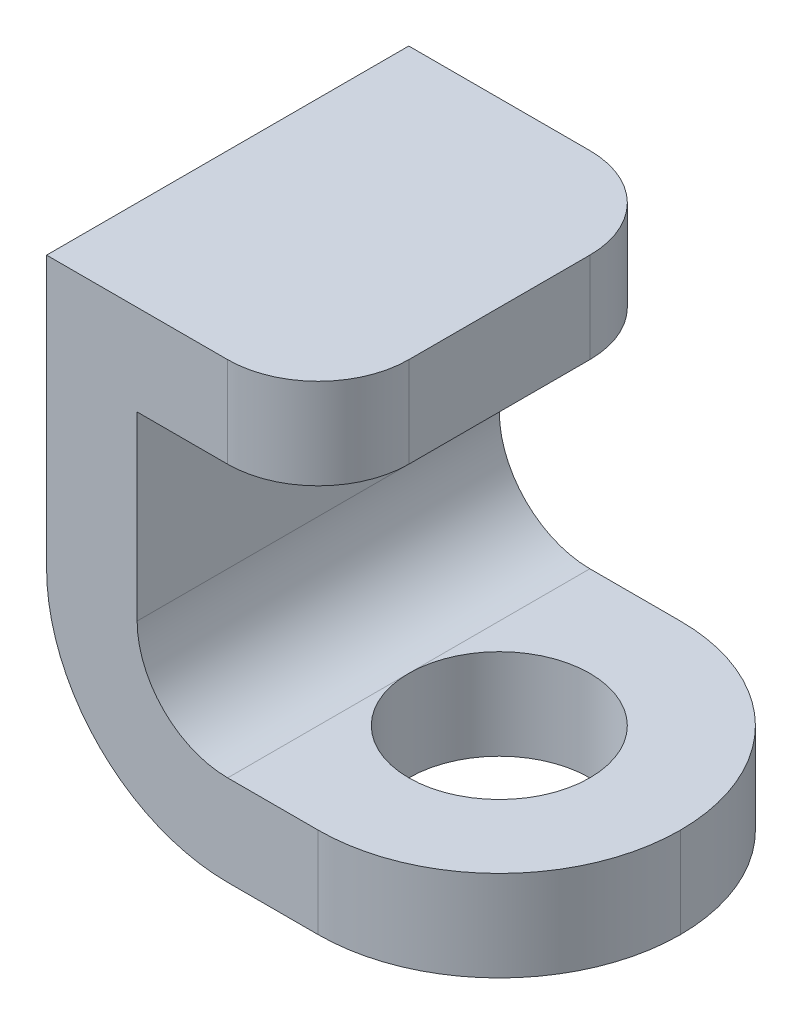
ISO-10303-21;
HEADER;
FILE_DESCRIPTION(('STEP AP214'),'2;1');
FILE_NAME('part.step','',(''),(''),'','','');
FILE_SCHEMA(('AUTOMOTIVE_DESIGN { 1 0 10303 214 1 1 1 1 }'));
ENDSEC;
DATA;
#1=APPLICATION_CONTEXT('core data for automotive mechanical design processes');
#2=APPLICATION_PROTOCOL_DEFINITION('international standard','automotive_design',2000,#1);
#3=PRODUCT_CONTEXT('',#1,'mechanical');
#4=PRODUCT('Part','Part','',(#3));
#5=PRODUCT_RELATED_PRODUCT_CATEGORY('part','',(#4));
#6=PRODUCT_DEFINITION_FORMATION('','',#4);
#7=PRODUCT_DEFINITION_CONTEXT('part definition',#1,'design');
#8=PRODUCT_DEFINITION('design','',#6,#7);
#9=PRODUCT_DEFINITION_SHAPE('','',#8);
#10=(LENGTH_UNIT() NAMED_UNIT(*) SI_UNIT(.MILLI.,.METRE.));
#11=(NAMED_UNIT(*) PLANE_ANGLE_UNIT() SI_UNIT($,.RADIAN.));
#12=(NAMED_UNIT(*) SI_UNIT($,.STERADIAN.) SOLID_ANGLE_UNIT());
#13=UNCERTAINTY_MEASURE_WITH_UNIT(LENGTH_MEASURE(1.E-05),#10,'distance_accuracy_value','');
#14=(GEOMETRIC_REPRESENTATION_CONTEXT(3) GLOBAL_UNCERTAINTY_ASSIGNED_CONTEXT((#13)) GLOBAL_UNIT_ASSIGNED_CONTEXT((#10,
#11,#12)) REPRESENTATION_CONTEXT('',''));
#15=CARTESIAN_POINT('',(0.,0.,0.));
#16=DIRECTION('',(0.,0.,1.));
#17=DIRECTION('',(1.,0.,0.));
#18=AXIS2_PLACEMENT_3D('',#15,#16,#17);
#19=CARTESIAN_POINT('',(5.,0.,-20.));
#20=DIRECTION('',(-1.,0.,0.));
#21=DIRECTION('',(0.,0.,1.));
#22=AXIS2_PLACEMENT_3D('',#19,#20,#21);
#23=PLANE('',#22);
#24=DIRECTION('',(0.,-1.,0.));
#25=VECTOR('',#24,1.);
#26=CARTESIAN_POINT('',(5.,0.,0.));
#27=LINE('',#26,#25);
#28=CARTESIAN_POINT('',(5.,-5.,0.));
#29=VERTEX_POINT('',#28);
#30=CARTESIAN_POINT('',(5.,-15.,0.));
#31=VERTEX_POINT('',#30);
#32=EDGE_CURVE('E171',#29,#31,#27,.T.);
#33=ORIENTED_EDGE('',*,*,#32,.T.);
#34=DIRECTION('',(0.,0.,1.));
#35=VECTOR('',#34,1.);
#36=CARTESIAN_POINT('',(5.,-15.,-20.));
#37=LINE('',#36,#35);
#38=CARTESIAN_POINT('',(5.,-15.,-20.));
#39=VERTEX_POINT('',#38);
#40=EDGE_CURVE('E149',#31,#39,#37,.F.);
#41=ORIENTED_EDGE('',*,*,#40,.T.);
#42=DIRECTION('',(0.,-1.,0.));
#43=VECTOR('',#42,1.);
#44=CARTESIAN_POINT('',(5.,0.,-20.));
#45=LINE('',#44,#43);
#46=CARTESIAN_POINT('',(5.,-5.,-20.));
#47=VERTEX_POINT('',#46);
#48=EDGE_CURVE('E147',#47,#39,#45,.T.);
#49=ORIENTED_EDGE('',*,*,#48,.F.);
#50=DIRECTION('',(0.,0.,1.));
#51=VECTOR('',#50,1.);
#52=CARTESIAN_POINT('',(5.,-5.,-20.));
#53=LINE('',#52,#51);
#54=EDGE_CURVE('E133',#47,#29,#53,.T.);
#55=ORIENTED_EDGE('',*,*,#54,.T.);
#56=EDGE_LOOP('',(#33,#41,#49,#55));
#57=FACE_BOUND('',#56,.T.);
#58=ADVANCED_FACE('F35',(#57),#23,.F.);
#59=CARTESIAN_POINT('',(0.,-20.,-20.));
#60=DIRECTION('',(0.,-1.,0.));
#61=DIRECTION('',(1.,0.,0.));
#62=AXIS2_PLACEMENT_3D('',#59,#60,#61);
#63=PLANE('',#62);
#64=DIRECTION('',(0.,0.,1.));
#65=VECTOR('',#64,1.);
#66=CARTESIAN_POINT('',(10.,-20.,0.));
#67=LINE('',#66,#65);
#68=CARTESIAN_POINT('',(10.,-20.,-20.));
#69=VERTEX_POINT('',#68);
#70=CARTESIAN_POINT('',(10.,-20.,-10.));
#71=VERTEX_POINT('',#70);
#72=EDGE_CURVE('E221',#69,#71,#67,.T.);
#73=ORIENTED_EDGE('',*,*,#72,.T.);
#74=CARTESIAN_POINT('',(15.,-20.,-10.));
#75=DIRECTION('',(0.,1.,0.));
#76=DIRECTION('',(-1.,0.,0.));
#77=AXIS2_PLACEMENT_3D('',#74,#75,#76);
#78=CIRCLE('',#77,5.);
#79=EDGE_CURVE('E53',#71,#71,#78,.T.);
#80=ORIENTED_EDGE('',*,*,#79,.F.);
#81=CARTESIAN_POINT('',(10.,-20.,0.));
#82=VERTEX_POINT('',#81);
#83=EDGE_CURVE('E218',#71,#82,#67,.T.);
#84=ORIENTED_EDGE('',*,*,#83,.T.);
#85=DIRECTION('',(1.,0.,0.));
#86=VECTOR('',#85,1.);
#87=CARTESIAN_POINT('',(0.,-20.,0.));
#88=LINE('',#87,#86);
#89=CARTESIAN_POINT('',(15.,-20.,0.));
#90=VERTEX_POINT('',#89);
#91=EDGE_CURVE('E152',#82,#90,#88,.T.);
#92=ORIENTED_EDGE('',*,*,#91,.T.);
#93=CARTESIAN_POINT('',(15.,-20.,-10.));
#94=DIRECTION('',(0.,-1.,0.));
#95=DIRECTION('',(1.,0.,0.));
#96=AXIS2_PLACEMENT_3D('',#93,#94,#95);
#97=CIRCLE('',#96,10.);
#98=CARTESIAN_POINT('',(25.,-20.,-10.));
#99=VERTEX_POINT('',#98);
#100=EDGE_CURVE('E205',#90,#99,#97,.F.);
#101=ORIENTED_EDGE('',*,*,#100,.T.);
#102=CARTESIAN_POINT('',(15.,-20.,-10.));
#103=DIRECTION('',(0.,-1.,0.));
#104=DIRECTION('',(1.,0.,0.));
#105=AXIS2_PLACEMENT_3D('',#102,#103,#104);
#106=CIRCLE('',#105,10.);
#107=CARTESIAN_POINT('',(15.,-20.,-20.));
#108=VERTEX_POINT('',#107);
#109=EDGE_CURVE('E207',#99,#108,#106,.F.);
#110=ORIENTED_EDGE('',*,*,#109,.T.);
#111=DIRECTION('',(1.,0.,0.));
#112=VECTOR('',#111,1.);
#113=CARTESIAN_POINT('',(0.,-20.,-20.));
#114=LINE('',#113,#112);
#115=EDGE_CURVE('E144',#69,#108,#114,.T.);
#116=ORIENTED_EDGE('',*,*,#115,.F.);
#117=EDGE_LOOP('',(#73,#80,#84,#92,#101,#110,#116));
#118=FACE_BOUND('',#117,.T.);
#119=ADVANCED_FACE('F250',(#118),#63,.F.);
#120=CARTESIAN_POINT('',(0.,-25.,-20.));
#121=DIRECTION('',(0.,-1.,0.));
#122=DIRECTION('',(1.,0.,0.));
#123=AXIS2_PLACEMENT_3D('',#120,#121,#122);
#124=PLANE('',#123);
#125=DIRECTION('',(0.,0.,1.));
#126=VECTOR('',#125,1.);
#127=CARTESIAN_POINT('',(10.,-25.,-20.));
#128=LINE('',#127,#126);
#129=CARTESIAN_POINT('',(10.,-25.,0.));
#130=VERTEX_POINT('',#129);
#131=CARTESIAN_POINT('',(10.,-25.,-10.));
#132=VERTEX_POINT('',#131);
#133=EDGE_CURVE('E198',#130,#132,#128,.F.);
#134=ORIENTED_EDGE('',*,*,#133,.T.);
#135=CARTESIAN_POINT('',(15.,-25.,-10.));
#136=DIRECTION('',(0.,1.,0.));
#137=DIRECTION('',(-1.,0.,0.));
#138=AXIS2_PLACEMENT_3D('',#135,#136,#137);
#139=CIRCLE('',#138,5.);
#140=EDGE_CURVE('E48',#132,#132,#139,.T.);
#141=ORIENTED_EDGE('',*,*,#140,.T.);
#142=CARTESIAN_POINT('',(10.,-25.,-20.));
#143=VERTEX_POINT('',#142);
#144=EDGE_CURVE('E197',#132,#143,#128,.F.);
#145=ORIENTED_EDGE('',*,*,#144,.T.);
#146=DIRECTION('',(1.,0.,0.));
#147=VECTOR('',#146,1.);
#148=CARTESIAN_POINT('',(0.,-25.,-20.));
#149=LINE('',#148,#147);
#150=CARTESIAN_POINT('',(15.,-25.,-20.));
#151=VERTEX_POINT('',#150);
#152=EDGE_CURVE('E167',#143,#151,#149,.T.);
#153=ORIENTED_EDGE('',*,*,#152,.T.);
#154=CARTESIAN_POINT('',(15.,-25.,-10.));
#155=DIRECTION('',(0.,-1.,0.));
#156=DIRECTION('',(1.,0.,0.));
#157=AXIS2_PLACEMENT_3D('',#154,#155,#156);
#158=CIRCLE('',#157,10.);
#159=CARTESIAN_POINT('',(25.,-25.,-10.));
#160=VERTEX_POINT('',#159);
#161=EDGE_CURVE('E203',#151,#160,#158,.T.);
#162=ORIENTED_EDGE('',*,*,#161,.T.);
#163=CARTESIAN_POINT('',(15.,-25.,-10.));
#164=DIRECTION('',(0.,-1.,0.));
#165=DIRECTION('',(1.,0.,0.));
#166=AXIS2_PLACEMENT_3D('',#163,#164,#165);
#167=CIRCLE('',#166,10.);
#168=CARTESIAN_POINT('',(15.,-25.,0.));
#169=VERTEX_POINT('',#168);
#170=EDGE_CURVE('E201',#160,#169,#167,.T.);
#171=ORIENTED_EDGE('',*,*,#170,.T.);
#172=DIRECTION('',(1.,0.,0.));
#173=VECTOR('',#172,1.);
#174=CARTESIAN_POINT('',(0.,-25.,0.));
#175=LINE('',#174,#173);
#176=EDGE_CURVE('E181',#130,#169,#175,.T.);
#177=ORIENTED_EDGE('',*,*,#176,.F.);
#178=EDGE_LOOP('',(#134,#141,#145,#153,#162,#171,#177));
#179=FACE_BOUND('',#178,.T.);
#180=ADVANCED_FACE('F260',(#179),#124,.T.);
#181=CARTESIAN_POINT('',(0.,0.,-20.));
#182=DIRECTION('',(-1.,0.,0.));
#183=DIRECTION('',(0.,0.,1.));
#184=AXIS2_PLACEMENT_3D('',#181,#182,#183);
#185=PLANE('',#184);
#186=DIRECTION('',(0.,-1.,0.));
#187=VECTOR('',#186,1.);
#188=CARTESIAN_POINT('',(0.,0.,-20.));
#189=LINE('',#188,#187);
#190=CARTESIAN_POINT('',(0.,0.,-20.));
#191=VERTEX_POINT('',#190);
#192=CARTESIAN_POINT('',(0.,-15.,-20.));
#193=VERTEX_POINT('',#192);
#194=EDGE_CURVE('E161',#191,#193,#189,.T.);
#195=ORIENTED_EDGE('',*,*,#194,.T.);
#196=DIRECTION('',(0.,0.,1.));
#197=VECTOR('',#196,1.);
#198=CARTESIAN_POINT('',(0.,-15.,-20.));
#199=LINE('',#198,#197);
#200=CARTESIAN_POINT('',(0.,-15.,0.));
#201=VERTEX_POINT('',#200);
#202=EDGE_CURVE('E215',#193,#201,#199,.T.);
#203=ORIENTED_EDGE('',*,*,#202,.T.);
#204=DIRECTION('',(0.,-1.,0.));
#205=VECTOR('',#204,1.);
#206=CARTESIAN_POINT('',(0.,0.,0.));
#207=LINE('',#206,#205);
#208=CARTESIAN_POINT('',(0.,0.,0.));
#209=VERTEX_POINT('',#208);
#210=EDGE_CURVE('E178',#209,#201,#207,.T.);
#211=ORIENTED_EDGE('',*,*,#210,.F.);
#212=DIRECTION('',(0.,0.,1.));
#213=VECTOR('',#212,1.);
#214=CARTESIAN_POINT('',(0.,0.,-20.));
#215=LINE('',#214,#213);
#216=EDGE_CURVE('E185',#191,#209,#215,.T.);
#217=ORIENTED_EDGE('',*,*,#216,.F.);
#218=EDGE_LOOP('',(#195,#203,#211,#217));
#219=FACE_BOUND('',#218,.T.);
#220=ADVANCED_FACE('F296',(#219),#185,.T.);
#221=CARTESIAN_POINT('',(0.,0.,-20.));
#222=DIRECTION('',(0.,-1.,0.));
#223=DIRECTION('',(0.,0.,-1.));
#224=AXIS2_PLACEMENT_3D('',#221,#222,#223);
#225=PLANE('',#224);
#226=DIRECTION('',(0.,0.,1.));
#227=VECTOR('',#226,1.);
#228=CARTESIAN_POINT('',(15.,0.,-20.));
#229=LINE('',#228,#227);
#230=CARTESIAN_POINT('',(15.,0.,-15.));
#231=VERTEX_POINT('',#230);
#232=CARTESIAN_POINT('',(15.,0.,-5.));
#233=VERTEX_POINT('',#232);
#234=EDGE_CURVE('E188',#231,#233,#229,.T.);
#235=ORIENTED_EDGE('',*,*,#234,.F.);
#236=CARTESIAN_POINT('',(10.,0.,-15.));
#237=DIRECTION('',(0.,-1.,0.));
#238=DIRECTION('',(0.,0.,-1.));
#239=AXIS2_PLACEMENT_3D('',#236,#237,#238);
#240=CIRCLE('',#239,5.);
#241=CARTESIAN_POINT('',(10.,0.,-20.));
#242=VERTEX_POINT('',#241);
#243=EDGE_CURVE('E237',#231,#242,#240,.F.);
#244=ORIENTED_EDGE('',*,*,#243,.T.);
#245=DIRECTION('',(1.,0.,0.));
#246=VECTOR('',#245,1.);
#247=CARTESIAN_POINT('',(0.,0.,-20.));
#248=LINE('',#247,#246);
#249=EDGE_CURVE('E159',#191,#242,#248,.T.);
#250=ORIENTED_EDGE('',*,*,#249,.F.);
#251=ORIENTED_EDGE('',*,*,#216,.T.);
#252=DIRECTION('',(1.,0.,0.));
#253=VECTOR('',#252,1.);
#254=CARTESIAN_POINT('',(0.,0.,0.));
#255=LINE('',#254,#253);
#256=CARTESIAN_POINT('',(10.,0.,0.));
#257=VERTEX_POINT('',#256);
#258=EDGE_CURVE('E175',#209,#257,#255,.T.);
#259=ORIENTED_EDGE('',*,*,#258,.T.);
#260=CARTESIAN_POINT('',(10.,0.,-5.));
#261=DIRECTION('',(0.,-1.,0.));
#262=DIRECTION('',(0.,0.,-1.));
#263=AXIS2_PLACEMENT_3D('',#260,#261,#262);
#264=CIRCLE('',#263,5.);
#265=EDGE_CURVE('E235',#257,#233,#264,.F.);
#266=ORIENTED_EDGE('',*,*,#265,.T.);
#267=EDGE_LOOP('',(#235,#244,#250,#251,#259,#266));
#268=FACE_BOUND('',#267,.T.);
#269=ADVANCED_FACE('F292',(#268),#225,.F.);
#270=CARTESIAN_POINT('',(15.,0.,-20.));
#271=DIRECTION('',(-1.,0.,0.));
#272=DIRECTION('',(0.,0.,1.));
#273=AXIS2_PLACEMENT_3D('',#270,#271,#272);
#274=PLANE('',#273);
#275=DIRECTION('',(0.,0.,1.));
#276=VECTOR('',#275,1.);
#277=CARTESIAN_POINT('',(15.,-5.,-20.));
#278=LINE('',#277,#276);
#279=CARTESIAN_POINT('',(15.,-5.,-15.));
#280=VERTEX_POINT('',#279);
#281=CARTESIAN_POINT('',(15.,-5.,-5.));
#282=VERTEX_POINT('',#281);
#283=EDGE_CURVE('E143',#280,#282,#278,.T.);
#284=ORIENTED_EDGE('',*,*,#283,.F.);
#285=DIRECTION('',(0.,-1.,0.));
#286=VECTOR('',#285,1.);
#287=CARTESIAN_POINT('',(15.,0.,-15.));
#288=LINE('',#287,#286);
#289=EDGE_CURVE('E233',#280,#231,#288,.F.);
#290=ORIENTED_EDGE('',*,*,#289,.T.);
#291=ORIENTED_EDGE('',*,*,#234,.T.);
#292=DIRECTION('',(0.,-1.,0.));
#293=VECTOR('',#292,1.);
#294=CARTESIAN_POINT('',(15.,-5.,-5.));
#295=LINE('',#294,#293);
#296=EDGE_CURVE('E230',#233,#282,#295,.T.);
#297=ORIENTED_EDGE('',*,*,#296,.T.);
#298=EDGE_LOOP('',(#284,#290,#291,#297));
#299=FACE_BOUND('',#298,.T.);
#300=ADVANCED_FACE('F289',(#299),#274,.F.);
#301=CARTESIAN_POINT('',(0.,-5.,-20.));
#302=DIRECTION('',(0.,-1.,0.));
#303=DIRECTION('',(0.,0.,-1.));
#304=AXIS2_PLACEMENT_3D('',#301,#302,#303);
#305=PLANE('',#304);
#306=DIRECTION('',(1.,0.,0.));
#307=VECTOR('',#306,1.);
#308=CARTESIAN_POINT('',(0.,-5.,-20.));
#309=LINE('',#308,#307);
#310=CARTESIAN_POINT('',(10.,-5.,-20.));
#311=VERTEX_POINT('',#310);
#312=EDGE_CURVE('E137',#47,#311,#309,.T.);
#313=ORIENTED_EDGE('',*,*,#312,.T.);
#314=CARTESIAN_POINT('',(10.,-5.,-15.));
#315=DIRECTION('',(0.,-1.,0.));
#316=DIRECTION('',(0.,0.,-1.));
#317=AXIS2_PLACEMENT_3D('',#314,#315,#316);
#318=CIRCLE('',#317,5.);
#319=EDGE_CURVE('E228',#311,#280,#318,.T.);
#320=ORIENTED_EDGE('',*,*,#319,.T.);
#321=ORIENTED_EDGE('',*,*,#283,.T.);
#322=CARTESIAN_POINT('',(10.,-5.,-5.));
#323=DIRECTION('',(0.,-1.,0.));
#324=DIRECTION('',(0.,0.,-1.));
#325=AXIS2_PLACEMENT_3D('',#322,#323,#324);
#326=CIRCLE('',#325,5.);
#327=CARTESIAN_POINT('',(10.,-5.,0.));
#328=VERTEX_POINT('',#327);
#329=EDGE_CURVE('E226',#282,#328,#326,.T.);
#330=ORIENTED_EDGE('',*,*,#329,.T.);
#331=DIRECTION('',(1.,0.,0.));
#332=VECTOR('',#331,1.);
#333=CARTESIAN_POINT('',(0.,-5.,0.));
#334=LINE('',#333,#332);
#335=EDGE_CURVE('E139',#29,#328,#334,.T.);
#336=ORIENTED_EDGE('',*,*,#335,.F.);
#337=ORIENTED_EDGE('',*,*,#54,.F.);
#338=EDGE_LOOP('',(#313,#320,#321,#330,#336,#337));
#339=FACE_BOUND('',#338,.T.);
#340=ADVANCED_FACE('F135',(#339),#305,.T.);
#341=CARTESIAN_POINT('',(0.,0.,-20.));
#342=DIRECTION('',(0.,0.,1.));
#343=DIRECTION('',(1.,0.,0.));
#344=AXIS2_PLACEMENT_3D('',#341,#342,#343);
#345=PLANE('',#344);
#346=ORIENTED_EDGE('',*,*,#249,.T.);
#347=DIRECTION('',(0.,-1.,0.));
#348=VECTOR('',#347,1.);
#349=CARTESIAN_POINT('',(10.,0.,-20.));
#350=LINE('',#349,#348);
#351=EDGE_CURVE('E158',#242,#311,#350,.T.);
#352=ORIENTED_EDGE('',*,*,#351,.T.);
#353=ORIENTED_EDGE('',*,*,#312,.F.);
#354=ORIENTED_EDGE('',*,*,#48,.T.);
#355=CARTESIAN_POINT('',(10.,-15.,-20.));
#356=DIRECTION('',(0.,0.,1.));
#357=DIRECTION('',(1.,0.,0.));
#358=AXIS2_PLACEMENT_3D('',#355,#356,#357);
#359=CIRCLE('',#358,5.);
#360=EDGE_CURVE('E11',#39,#69,#359,.T.);
#361=ORIENTED_EDGE('',*,*,#360,.T.);
#362=ORIENTED_EDGE('',*,*,#115,.T.);
#363=DIRECTION('',(0.,-1.,0.));
#364=VECTOR('',#363,1.);
#365=CARTESIAN_POINT('',(15.,0.,-20.));
#366=LINE('',#365,#364);
#367=EDGE_CURVE('E194',#108,#151,#366,.T.);
#368=ORIENTED_EDGE('',*,*,#367,.T.);
#369=ORIENTED_EDGE('',*,*,#152,.F.);
#370=CARTESIAN_POINT('',(10.,-15.,-20.));
#371=DIRECTION('',(0.,0.,1.));
#372=DIRECTION('',(1.,0.,0.));
#373=AXIS2_PLACEMENT_3D('',#370,#371,#372);
#374=CIRCLE('',#373,10.);
#375=EDGE_CURVE('E187',#143,#193,#374,.F.);
#376=ORIENTED_EDGE('',*,*,#375,.T.);
#377=ORIENTED_EDGE('',*,*,#194,.F.);
#378=EDGE_LOOP('',(#346,#352,#353,#354,#361,#362,#368,#369,#376,#377));
#379=FACE_BOUND('',#378,.T.);
#380=ADVANCED_FACE('F156',(#379),#345,.F.);
#381=CARTESIAN_POINT('',(0.,0.,0.));
#382=DIRECTION('',(0.,0.,1.));
#383=DIRECTION('',(1.,0.,0.));
#384=AXIS2_PLACEMENT_3D('',#381,#382,#383);
#385=PLANE('',#384);
#386=ORIENTED_EDGE('',*,*,#335,.T.);
#387=DIRECTION('',(0.,-1.,0.));
#388=VECTOR('',#387,1.);
#389=CARTESIAN_POINT('',(10.,0.,0.));
#390=LINE('',#389,#388);
#391=EDGE_CURVE('E239',#328,#257,#390,.F.);
#392=ORIENTED_EDGE('',*,*,#391,.T.);
#393=ORIENTED_EDGE('',*,*,#258,.F.);
#394=ORIENTED_EDGE('',*,*,#210,.T.);
#395=CARTESIAN_POINT('',(10.,-15.,0.));
#396=DIRECTION('',(0.,0.,1.));
#397=DIRECTION('',(1.,0.,0.));
#398=AXIS2_PLACEMENT_3D('',#395,#396,#397);
#399=CIRCLE('',#398,10.);
#400=EDGE_CURVE('E210',#201,#130,#399,.T.);
#401=ORIENTED_EDGE('',*,*,#400,.T.);
#402=ORIENTED_EDGE('',*,*,#176,.T.);
#403=DIRECTION('',(0.,-1.,0.));
#404=VECTOR('',#403,1.);
#405=CARTESIAN_POINT('',(15.,-20.,0.));
#406=LINE('',#405,#404);
#407=EDGE_CURVE('E212',#169,#90,#406,.F.);
#408=ORIENTED_EDGE('',*,*,#407,.T.);
#409=ORIENTED_EDGE('',*,*,#91,.F.);
#410=CARTESIAN_POINT('',(10.,-15.,0.));
#411=DIRECTION('',(0.,0.,1.));
#412=DIRECTION('',(1.,0.,0.));
#413=AXIS2_PLACEMENT_3D('',#410,#411,#412);
#414=CIRCLE('',#413,5.);
#415=EDGE_CURVE('E43',#82,#31,#414,.F.);
#416=ORIENTED_EDGE('',*,*,#415,.T.);
#417=ORIENTED_EDGE('',*,*,#32,.F.);
#418=EDGE_LOOP('',(#386,#392,#393,#394,#401,#402,#408,#409,#416,#417));
#419=FACE_BOUND('',#418,.T.);
#420=ADVANCED_FACE('F243',(#419),#385,.T.);
#421=CARTESIAN_POINT('',(15.,0.,-10.));
#422=DIRECTION('',(0.,1.,0.));
#423=DIRECTION('',(-1.,0.,0.));
#424=AXIS2_PLACEMENT_3D('',#421,#422,#423);
#425=CYLINDRICAL_SURFACE('',#424,10.);
#426=DIRECTION('',(0.,-1.,0.));
#427=VECTOR('',#426,1.);
#428=CARTESIAN_POINT('',(25.,-25.,-10.));
#429=LINE('',#428,#427);
#430=EDGE_CURVE('E173',#99,#160,#429,.T.);
#431=ORIENTED_EDGE('',*,*,#430,.F.);
#432=ORIENTED_EDGE('',*,*,#100,.F.);
#433=ORIENTED_EDGE('',*,*,#407,.F.);
#434=ORIENTED_EDGE('',*,*,#170,.F.);
#435=EDGE_LOOP('',(#431,#432,#433,#434));
#436=FACE_BOUND('',#435,.T.);
#437=ADVANCED_FACE('F270',(#436),#425,.T.);
#438=CARTESIAN_POINT('',(15.,0.,-10.));
#439=DIRECTION('',(0.,-1.,0.));
#440=DIRECTION('',(1.,0.,0.));
#441=AXIS2_PLACEMENT_3D('',#438,#439,#440);
#442=CYLINDRICAL_SURFACE('',#441,10.);
#443=ORIENTED_EDGE('',*,*,#109,.F.);
#444=ORIENTED_EDGE('',*,*,#430,.T.);
#445=ORIENTED_EDGE('',*,*,#161,.F.);
#446=ORIENTED_EDGE('',*,*,#367,.F.);
#447=EDGE_LOOP('',(#443,#444,#445,#446));
#448=FACE_BOUND('',#447,.T.);
#449=ADVANCED_FACE('F256',(#448),#442,.T.);
#450=CARTESIAN_POINT('',(10.,-15.,-20.));
#451=DIRECTION('',(0.,0.,1.));
#452=DIRECTION('',(1.,0.,0.));
#453=AXIS2_PLACEMENT_3D('',#450,#451,#452);
#454=CYLINDRICAL_SURFACE('',#453,10.);
#455=ORIENTED_EDGE('',*,*,#375,.F.);
#456=ORIENTED_EDGE('',*,*,#144,.F.);
#457=ORIENTED_EDGE('',*,*,#133,.F.);
#458=ORIENTED_EDGE('',*,*,#400,.F.);
#459=ORIENTED_EDGE('',*,*,#202,.F.);
#460=EDGE_LOOP('',(#455,#456,#457,#458,#459));
#461=FACE_BOUND('',#460,.T.);
#462=ADVANCED_FACE('F265',(#461),#454,.T.);
#463=CARTESIAN_POINT('',(10.,-15.,-20.));
#464=DIRECTION('',(0.,0.,-1.));
#465=DIRECTION('',(-1.,0.,0.));
#466=AXIS2_PLACEMENT_3D('',#463,#464,#465);
#467=CYLINDRICAL_SURFACE('',#466,5.);
#468=ORIENTED_EDGE('',*,*,#360,.F.);
#469=ORIENTED_EDGE('',*,*,#40,.F.);
#470=ORIENTED_EDGE('',*,*,#415,.F.);
#471=ORIENTED_EDGE('',*,*,#83,.F.);
#472=ORIENTED_EDGE('',*,*,#72,.F.);
#473=EDGE_LOOP('',(#468,#469,#470,#471,#472));
#474=FACE_BOUND('',#473,.T.);
#475=ADVANCED_FACE('F246',(#474),#467,.F.);
#476=CARTESIAN_POINT('',(10.,0.,-15.));
#477=DIRECTION('',(0.,-1.,0.));
#478=DIRECTION('',(0.,0.,-1.));
#479=AXIS2_PLACEMENT_3D('',#476,#477,#478);
#480=CYLINDRICAL_SURFACE('',#479,5.);
#481=ORIENTED_EDGE('',*,*,#243,.F.);
#482=ORIENTED_EDGE('',*,*,#289,.F.);
#483=ORIENTED_EDGE('',*,*,#319,.F.);
#484=ORIENTED_EDGE('',*,*,#351,.F.);
#485=EDGE_LOOP('',(#481,#482,#483,#484));
#486=FACE_BOUND('',#485,.T.);
#487=ADVANCED_FACE('F310',(#486),#480,.T.);
#488=CARTESIAN_POINT('',(10.,0.,-5.));
#489=DIRECTION('',(0.,1.,0.));
#490=DIRECTION('',(0.,0.,1.));
#491=AXIS2_PLACEMENT_3D('',#488,#489,#490);
#492=CYLINDRICAL_SURFACE('',#491,5.);
#493=ORIENTED_EDGE('',*,*,#265,.F.);
#494=ORIENTED_EDGE('',*,*,#391,.F.);
#495=ORIENTED_EDGE('',*,*,#329,.F.);
#496=ORIENTED_EDGE('',*,*,#296,.F.);
#497=EDGE_LOOP('',(#493,#494,#495,#496));
#498=FACE_BOUND('',#497,.T.);
#499=ADVANCED_FACE('F37',(#498),#492,.T.);
#500=CARTESIAN_POINT('',(15.,-25.,-10.));
#501=DIRECTION('',(0.,1.,0.));
#502=DIRECTION('',(-1.,0.,0.));
#503=AXIS2_PLACEMENT_3D('',#500,#501,#502);
#504=CYLINDRICAL_SURFACE('',#503,5.);
#505=ORIENTED_EDGE('',*,*,#140,.F.);
#506=EDGE_LOOP('',(#505));
#507=FACE_BOUND('',#506,.T.);
#508=ORIENTED_EDGE('',*,*,#79,.T.);
#509=EDGE_LOOP('',(#508));
#510=FACE_BOUND('',#509,.T.);
#511=ADVANCED_FACE('F305',(#507,#510),#504,.F.);
#512=CLOSED_SHELL('',(#58,#119,#180,#220,#269,#300,#340,#380,#420,#437,#449,#462,#475,#487,#499,#511));
#513=MANIFOLD_SOLID_BREP('B2',#512);
#514=ADVANCED_BREP_SHAPE_REPRESENTATION('',(#18,#513),#14);
#515=SHAPE_DEFINITION_REPRESENTATION(#9,#514);
ENDSEC;
END-ISO-10303-21;
